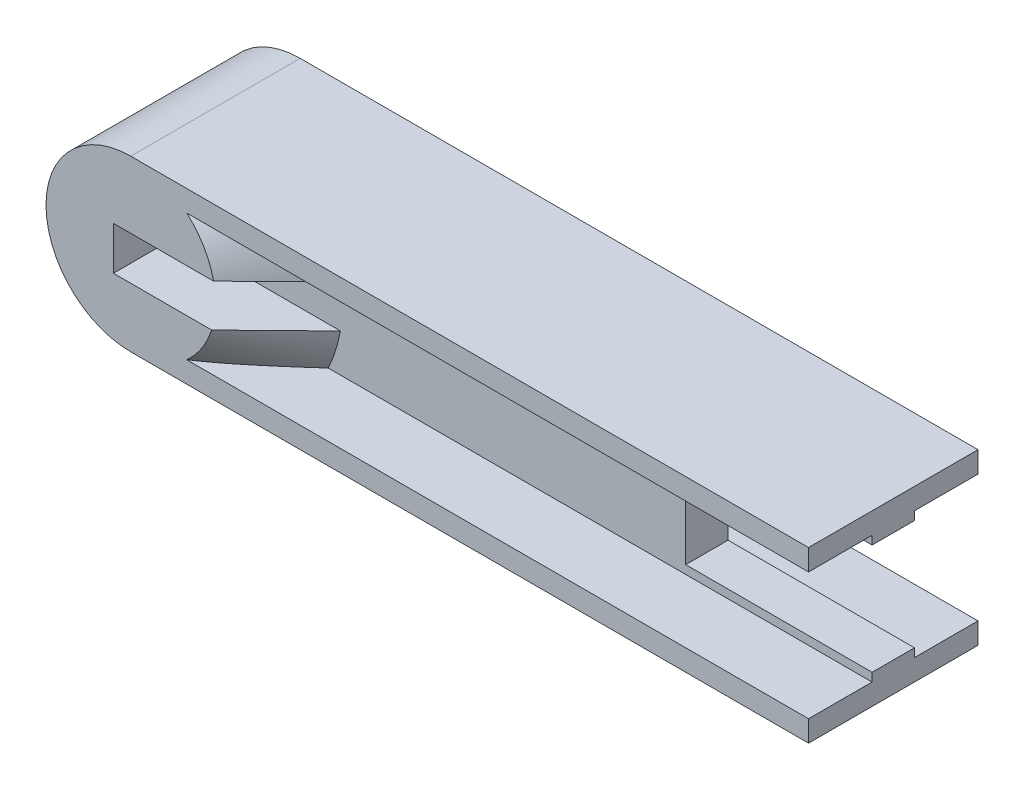
ISO-10303-21;
HEADER;
FILE_DESCRIPTION(('STEP AP214'),'2;1');
FILE_NAME('part.step','',(''),(''),'','','');
FILE_SCHEMA(('AUTOMOTIVE_DESIGN { 1 0 10303 214 1 1 1 1 }'));
ENDSEC;
DATA;
#1=APPLICATION_CONTEXT('core data for automotive mechanical design processes');
#2=APPLICATION_PROTOCOL_DEFINITION('international standard','automotive_design',2000,#1);
#3=PRODUCT_CONTEXT('',#1,'mechanical');
#4=PRODUCT('Part','Part','',(#3));
#5=PRODUCT_RELATED_PRODUCT_CATEGORY('part','',(#4));
#6=PRODUCT_DEFINITION_FORMATION('','',#4);
#7=PRODUCT_DEFINITION_CONTEXT('part definition',#1,'design');
#8=PRODUCT_DEFINITION('design','',#6,#7);
#9=PRODUCT_DEFINITION_SHAPE('','',#8);
#10=(LENGTH_UNIT() NAMED_UNIT(*) SI_UNIT(.MILLI.,.METRE.));
#11=(NAMED_UNIT(*) PLANE_ANGLE_UNIT() SI_UNIT($,.RADIAN.));
#12=(NAMED_UNIT(*) SI_UNIT($,.STERADIAN.) SOLID_ANGLE_UNIT());
#13=UNCERTAINTY_MEASURE_WITH_UNIT(LENGTH_MEASURE(1.E-05),#10,'distance_accuracy_value','');
#14=(GEOMETRIC_REPRESENTATION_CONTEXT(3) GLOBAL_UNCERTAINTY_ASSIGNED_CONTEXT((#13)) GLOBAL_UNIT_ASSIGNED_CONTEXT((#10,
#11,#12)) REPRESENTATION_CONTEXT('',''));
#15=CARTESIAN_POINT('',(0.,0.,0.));
#16=DIRECTION('',(0.,0.,1.));
#17=DIRECTION('',(1.,0.,0.));
#18=AXIS2_PLACEMENT_3D('',#15,#16,#17);
#19=CARTESIAN_POINT('',(40.,10.,10.));
#20=DIRECTION('',(-1.,0.,0.));
#21=DIRECTION('',(0.,0.,1.));
#22=AXIS2_PLACEMENT_3D('',#19,#20,#21);
#23=PLANE('',#22);
#24=DIRECTION('',(0.,1.,0.));
#25=VECTOR('',#24,1.);
#26=CARTESIAN_POINT('',(40.,-7.5,2.49999999999998));
#27=LINE('',#26,#25);
#28=CARTESIAN_POINT('',(40.,6.49999999999999,2.49999999999998));
#29=VERTEX_POINT('',#28);
#30=CARTESIAN_POINT('',(40.,7.5,2.49999999999998));
#31=VERTEX_POINT('',#30);
#32=EDGE_CURVE('E204',#29,#31,#27,.T.);
#33=ORIENTED_EDGE('',*,*,#32,.F.);
#34=DIRECTION('',(0.,0.,-1.));
#35=VECTOR('',#34,1.);
#36=CARTESIAN_POINT('',(40.,6.49999999999999,10.001));
#37=LINE('',#36,#35);
#38=CARTESIAN_POINT('',(40.,6.49999999999999,-2.5));
#39=VERTEX_POINT('',#38);
#40=EDGE_CURVE('E186',#29,#39,#37,.T.);
#41=ORIENTED_EDGE('',*,*,#40,.T.);
#42=DIRECTION('',(0.,1.,0.));
#43=VECTOR('',#42,1.);
#44=CARTESIAN_POINT('',(40.,-7.5,-2.5));
#45=LINE('',#44,#43);
#46=CARTESIAN_POINT('',(40.,7.5,-2.5));
#47=VERTEX_POINT('',#46);
#48=EDGE_CURVE('E347',#39,#47,#45,.T.);
#49=ORIENTED_EDGE('',*,*,#48,.T.);
#50=DIRECTION('',(0.,0.,-1.));
#51=VECTOR('',#50,1.);
#52=CARTESIAN_POINT('',(40.,7.5,-10.));
#53=LINE('',#52,#51);
#54=CARTESIAN_POINT('',(40.,7.5,-10.));
#55=VERTEX_POINT('',#54);
#56=EDGE_CURVE('E348',#47,#55,#53,.T.);
#57=ORIENTED_EDGE('',*,*,#56,.T.);
#58=DIRECTION('',(0.,-1.,0.));
#59=VECTOR('',#58,1.);
#60=CARTESIAN_POINT('',(40.,10.,-10.));
#61=LINE('',#60,#59);
#62=CARTESIAN_POINT('',(40.,10.,-10.));
#63=VERTEX_POINT('',#62);
#64=EDGE_CURVE('E237',#63,#55,#61,.T.);
#65=ORIENTED_EDGE('',*,*,#64,.F.);
#66=DIRECTION('',(0.,0.,-1.));
#67=VECTOR('',#66,1.);
#68=CARTESIAN_POINT('',(40.,10.,10.));
#69=LINE('',#68,#67);
#70=CARTESIAN_POINT('',(40.,10.,10.));
#71=VERTEX_POINT('',#70);
#72=EDGE_CURVE('E217',#71,#63,#69,.T.);
#73=ORIENTED_EDGE('',*,*,#72,.F.);
#74=DIRECTION('',(0.,-1.,0.));
#75=VECTOR('',#74,1.);
#76=CARTESIAN_POINT('',(40.,10.,10.));
#77=LINE('',#76,#75);
#78=CARTESIAN_POINT('',(40.,7.5,10.));
#79=VERTEX_POINT('',#78);
#80=EDGE_CURVE('E241',#71,#79,#77,.T.);
#81=ORIENTED_EDGE('',*,*,#80,.T.);
#82=DIRECTION('',(0.,0.,-1.));
#83=VECTOR('',#82,1.);
#84=CARTESIAN_POINT('',(40.,7.5,2.49999999999998));
#85=LINE('',#84,#83);
#86=EDGE_CURVE('E328',#79,#31,#85,.T.);
#87=ORIENTED_EDGE('',*,*,#86,.T.);
#88=EDGE_LOOP('',(#33,#41,#49,#57,#65,#73,#81,#87));
#89=FACE_BOUND('',#88,.T.);
#90=ADVANCED_FACE('F36',(#89),#23,.F.);
#91=CARTESIAN_POINT('',(-40.,0.,10.0000000000001));
#92=DIRECTION('',(0.,0.,-1.));
#93=DIRECTION('',(-1.,0.,0.));
#94=AXIS2_PLACEMENT_3D('',#91,#92,#93);
#95=CONICAL_SURFACE('',#94,10.,0.785398163397442);
#96=CARTESIAN_POINT('',(-40.,0.,2.50000000000002));
#97=DIRECTION('',(0.,0.,-1.));
#98=DIRECTION('',(-1.,0.,0.));
#99=AXIS2_PLACEMENT_3D('',#96,#97,#98);
#100=CIRCLE('',#99,17.5);
#101=CARTESIAN_POINT('',(-22.757110573551,-2.98877303040103,2.50000000000001));
#102=VERTEX_POINT('',#101);
#103=CARTESIAN_POINT('',(-24.1886116991581,-7.5,2.50000000000002));
#104=VERTEX_POINT('',#103);
#105=EDGE_CURVE('E285',#102,#104,#100,.T.);
#106=ORIENTED_EDGE('',*,*,#105,.F.);
#107=CARTESIAN_POINT('',(-14.7445242726451,-2.98877303040103,-5.43170891706394));
#108=CARTESIAN_POINT('',(-15.6182505198501,-2.98877303040103,-4.56408729212419));
#109=CARTESIAN_POINT('',(-16.492241290446,-2.98877303040103,-3.69673127284562));
#110=CARTESIAN_POINT('',(-18.2412856881804,-2.98877303040103,-1.96271064478842));
#111=CARTESIAN_POINT('',(-19.1163395052938,-2.98877303040103,-1.09604622765608));
#112=CARTESIAN_POINT('',(-20.8718875580076,-2.98877303040103,0.640230436556813));
#113=CARTESIAN_POINT('',(-21.7523876758202,-2.98877303040103,1.5098367376275));
#114=CARTESIAN_POINT('',(-23.515054490883,-2.98877303040103,3.24698476354142));
#115=CARTESIAN_POINT('',(-24.3972207933,-2.98877303040103,4.11452688860678));
#116=CARTESIAN_POINT('',(-25.7277017430086,-2.98877303040103,5.41838491746409));
#117=CARTESIAN_POINT('',(-26.1748895320108,-2.98877303040103,5.85585039426884));
#118=CARTESIAN_POINT('',(-27.0703086668402,-2.98877303040103,6.72972865022292));
#119=CARTESIAN_POINT('',(-27.5185400313316,-2.98877303040103,7.16614141025597));
#120=CARTESIAN_POINT('',(-28.4166945700879,-2.98877303040103,8.03781070800355));
#121=CARTESIAN_POINT('',(-28.866618656977,-2.98877303040103,8.47306630617011));
#122=CARTESIAN_POINT('',(-29.768406985442,-2.98877303040103,9.34150635503631));
#123=CARTESIAN_POINT('',(-30.2202711010452,-2.98877303040103,9.77469093646614));
#124=CARTESIAN_POINT('',(-31.1255191615767,-2.98877303040103,10.6367767315578));
#125=CARTESIAN_POINT('',(-31.5788946047338,-2.98877303040103,11.0656868465697));
#126=CARTESIAN_POINT('',(-32.2623431121828,-2.98877303040103,11.7055566842361));
#127=CARTESIAN_POINT('',(-32.4907533729852,-2.98877303040103,11.9182914606851));
#128=CARTESIAN_POINT('',(-32.9490026502527,-2.98877303040103,12.3422116740212));
#129=CARTESIAN_POINT('',(-33.1788416460464,-2.98877303040103,12.5533971332281));
#130=CARTESIAN_POINT('',(-33.6401166830084,-2.98877303040103,12.9734927498295));
#131=CARTESIAN_POINT('',(-33.8715506173452,-2.98877303040103,13.1824052160268));
#132=CARTESIAN_POINT('',(-34.33688593183,-2.98877303040103,13.5974576621289));
#133=CARTESIAN_POINT('',(-34.5707872568108,-2.98877303040103,13.8035977037875));
#134=CARTESIAN_POINT('',(-35.0418761340152,-2.98877303040103,14.211919878851));
#135=CARTESIAN_POINT('',(-35.2790623331825,-2.98877303040103,14.4141035636829));
#136=CARTESIAN_POINT('',(-35.6384179205598,-2.98877303040103,14.7130541622946));
#137=CARTESIAN_POINT('',(-35.7587923358589,-2.98877303040103,14.8119781316089));
#138=CARTESIAN_POINT('',(-36.0009922082745,-2.98877303040103,15.008031314904));
#139=CARTESIAN_POINT('',(-36.1228176154753,-2.98877303040103,15.1051605903325));
#140=CARTESIAN_POINT('',(-36.3073099764119,-2.98877303040103,15.2495000301054));
#141=CARTESIAN_POINT('',(-36.3693186791307,-2.98877303040103,15.2975522537624));
#142=CARTESIAN_POINT('',(-36.4938357766987,-2.98877303040103,15.3930105333198));
#143=CARTESIAN_POINT('',(-36.5563441907755,-2.98877303040103,15.4404165641649));
#144=CARTESIAN_POINT('',(-36.6819130400563,-2.98877303040103,15.5344949495441));
#145=CARTESIAN_POINT('',(-36.7449734833915,-2.98877303040103,15.5811672932427));
#146=CARTESIAN_POINT('',(-36.8717063506098,-2.98877303040103,15.6736721450626));
#147=CARTESIAN_POINT('',(-36.9353787728793,-2.98877303040103,15.7195046553972));
#148=CARTESIAN_POINT('',(-37.1285972913829,-2.98877303040103,15.8564052982744));
#149=CARTESIAN_POINT('',(-37.2591922406827,-2.98877303040103,15.9460068964985));
#150=CARTESIAN_POINT('',(-37.5238288190294,-2.98877303040103,16.1200201939822));
#151=CARTESIAN_POINT('',(-37.6578706656219,-2.98877303040103,16.2044315645227));
#152=CARTESIAN_POINT('',(-37.9329095280649,-2.98877303040103,16.3677645106028));
#153=CARTESIAN_POINT('',(-38.0739916358583,-2.98877303040103,16.446544672916));
#154=CARTESIAN_POINT('',(-38.3615715613253,-2.98877303040103,16.5938384833167));
#155=CARTESIAN_POINT('',(-38.5080717435589,-2.98877303040103,16.6623475813819));
#156=CARTESIAN_POINT('',(-38.8052742741623,-2.98877303040103,16.7840914402237));
#157=CARTESIAN_POINT('',(-38.9558969010027,-2.98877303040103,16.8375137527618));
#158=CARTESIAN_POINT('',(-39.1858435065229,-2.98877303040103,16.9031910256877));
#159=CARTESIAN_POINT('',(-39.2631172508603,-2.98877303040103,16.9226672923141));
#160=CARTESIAN_POINT('',(-39.4188227358405,-2.98877303040103,16.9561939977938));
#161=CARTESIAN_POINT('',(-39.4972541197915,-2.98877303040103,16.9702460731525));
#162=CARTESIAN_POINT('',(-39.6705088933478,-2.98877303040103,16.994570114377));
#163=CARTESIAN_POINT('',(-39.7655184693589,-2.98877303040103,17.0035525685882));
#164=CARTESIAN_POINT('',(-39.9559640845932,-2.98877303040103,17.012416275352));
#165=CARTESIAN_POINT('',(-40.0514001165385,-2.98877303040103,17.0122976826321));
#166=CARTESIAN_POINT('',(-40.2422908401708,-2.98877303040103,17.0029457605008));
#167=CARTESIAN_POINT('',(-40.3377432841214,-2.98877303040103,16.9936672995145));
#168=CARTESIAN_POINT('',(-40.5273879092856,-2.98877303040103,16.9665058079521));
#169=CARTESIAN_POINT('',(-40.6215801910689,-2.98877303040103,16.9486234682871));
#170=CARTESIAN_POINT('',(-40.8180170893483,-2.98877303040103,16.9029292197619));
#171=CARTESIAN_POINT('',(-40.920060265781,-2.98877303040103,16.8742674370877));
#172=CARTESIAN_POINT('',(-41.1209629067274,-2.98877303040103,16.8093386199395));
#173=CARTESIAN_POINT('',(-41.2198390817942,-2.98877303040103,16.7731236533291));
#174=CARTESIAN_POINT('',(-41.3173306394025,-2.98877303040103,16.7337905393622));
#175=B_SPLINE_CURVE_WITH_KNOTS('',3,(#107,#108,#109,#110,#111,#112,#113,#114,#115,#116,#117,
#118,#119,#120,#121,#122,#123,#124,#125,#126,#127,#128,#129,#130,#131,#132,#133,#134,#135,#136,
#137,#138,#139,#140,#141,#142,#143,#144,#145,#146,#147,#148,#149,#150,#151,#152,#153,#154,#155,
#156,#157,#158,#159,#160,#161,#162,#163,#164,#165,#166,#167,#168,#169,#170,#171,#172,#173,#174),
.UNSPECIFIED.,.F.,.F.,(4,2,2,2,2,2,2,2,2,2,2,2,2,2,2,2,2,2,2,2,2,2,2,2,2,2,2,2,2,2,2,2,2,4),(0.,
3.69398017540125,7.38876459717517,11.1013714404907,14.8131876726317,16.6899326936052,
18.566711541622,20.4447142345938,22.3225967730828,24.1949010937752,25.131296377106,
26.067678143848,27.0029979568064,27.9382969015853,28.873221419511,29.3406314269986,
29.8080254012898,30.043366071396,30.2787158407816,30.5140690826845,30.7494217042479,
31.2244565952992,31.6995215413825,32.1839724690067,32.6686373754713,33.1469813963222,
33.3858889457456,33.624724359138,33.9105970967216,34.1964649741634,34.4837484162256,
34.7710087926213,35.0886376648048,35.4041453397935),.UNSPECIFIED.);
#176=CARTESIAN_POINT('',(-30.4570845244889,-2.98877303040103,10.));
#177=VERTEX_POINT('',#176);
#178=EDGE_CURVE('E11',#102,#177,#175,.T.);
#179=ORIENTED_EDGE('',*,*,#178,.T.);
#180=CARTESIAN_POINT('',(-40.,0.,10.));
#181=DIRECTION('',(0.,0.,1.));
#182=DIRECTION('',(1.,0.,0.));
#183=AXIS2_PLACEMENT_3D('',#180,#181,#182);
#184=CIRCLE('',#183,10.);
#185=CARTESIAN_POINT('',(-33.3856217223385,-7.5,10.));
#186=VERTEX_POINT('',#185);
#187=EDGE_CURVE('E365',#186,#177,#184,.T.);
#188=ORIENTED_EDGE('',*,*,#187,.F.);
#189=CARTESIAN_POINT('',(-24.1886116991581,-7.5,2.50000000000002));
#190=CARTESIAN_POINT('',(-24.5558585087573,-7.5,2.83176164391592));
#191=CARTESIAN_POINT('',(-24.92411994844,-7.5,3.16241019080172));
#192=CARTESIAN_POINT('',(-25.6631954709516,-7.5,3.82083627059252));
#193=CARTESIAN_POINT('',(-26.0340095397421,-7.5,4.14861381926439));
#194=CARTESIAN_POINT('',(-26.7782955983122,-7.5,4.80028713955975));
#195=CARTESIAN_POINT('',(-27.151764098284,-7.5,5.1241868906016));
#196=CARTESIAN_POINT('',(-27.9024907874228,-7.5,5.76756343158426));
#197=CARTESIAN_POINT('',(-28.2797489283174,-7.5,6.08704027774087));
#198=CARTESIAN_POINT('',(-29.0393823834933,-7.5,6.7206482286359));
#199=CARTESIAN_POINT('',(-29.4217624781195,-7.5,7.03477361262254));
#200=CARTESIAN_POINT('',(-30.1924788992259,-7.5,7.65556114538951));
#201=CARTESIAN_POINT('',(-30.5808143977761,-7.5,7.96222431651734));
#202=CARTESIAN_POINT('',(-31.1693370656366,-7.5,8.41488189040015));
#203=CARTESIAN_POINT('',(-31.3666355885924,-7.5,8.56463316642127));
#204=CARTESIAN_POINT('',(-31.7634407954171,-7.5,8.86117088315843));
#205=CARTESIAN_POINT('',(-31.962947400111,-7.5,9.0079574296508));
#206=CARTESIAN_POINT('',(-32.3645764660876,-7.5,9.29811466160598));
#207=CARTESIAN_POINT('',(-32.5667000879372,-7.5,9.44148374545928));
#208=CARTESIAN_POINT('',(-32.973875864108,-7.5,9.72405096673029));
#209=CARTESIAN_POINT('',(-33.178928377817,-7.5,9.86324858568512));
#210=CARTESIAN_POINT('',(-33.3856217223385,-7.5,10.0000000000001));
#211=B_SPLINE_CURVE_WITH_KNOTS('',3,(#189,#190,#191,#192,#193,#194,#195,#196,#197,#198,#199,
#200,#201,#202,#203,#204,#205,#206,#207,#208,#209,#210),.UNSPECIFIED.,.F.,.F.,(4,2,2,2,2,2,2,2,
2,2,4),(0.,1.4847381435903,2.96946812820856,4.4525149065041,5.93554281771689,7.42006751142696,
8.90438766206993,9.64744643904511,10.390478657988,11.1338525155219,11.8773183854893),.UNSPECIFIED.);
#212=EDGE_CURVE('E424',#104,#186,#211,.T.);
#213=ORIENTED_EDGE('',*,*,#212,.F.);
#214=EDGE_LOOP('',(#106,#179,#188,#213));
#215=FACE_BOUND('',#214,.T.);
#216=ADVANCED_FACE('F316',(#215),#95,.T.);
#217=CARTESIAN_POINT('',(0.,-7.5,0.));
#218=DIRECTION('',(0.,-1.,0.));
#219=DIRECTION('',(0.,0.,-1.));
#220=AXIS2_PLACEMENT_3D('',#217,#218,#219);
#221=PLANE('',#220);
#222=DIRECTION('',(-1.,0.,0.));
#223=VECTOR('',#222,1.);
#224=CARTESIAN_POINT('',(40.,-7.5,2.49999999999998));
#225=LINE('',#224,#223);
#226=CARTESIAN_POINT('',(40.,-7.5,2.49999999999998));
#227=VERTEX_POINT('',#226);
#228=EDGE_CURVE('E201',#227,#104,#225,.T.);
#229=ORIENTED_EDGE('',*,*,#228,.T.);
#230=ORIENTED_EDGE('',*,*,#212,.T.);
#231=DIRECTION('',(1.,0.,0.));
#232=VECTOR('',#231,1.);
#233=CARTESIAN_POINT('',(40.,-7.5,10.));
#234=LINE('',#233,#232);
#235=CARTESIAN_POINT('',(40.,-7.5,10.));
#236=VERTEX_POINT('',#235);
#237=EDGE_CURVE('E209',#186,#236,#234,.T.);
#238=ORIENTED_EDGE('',*,*,#237,.T.);
#239=DIRECTION('',(0.,0.,-1.));
#240=VECTOR('',#239,1.);
#241=CARTESIAN_POINT('',(40.,-7.5,2.49999999999998));
#242=LINE('',#241,#240);
#243=EDGE_CURVE('E339',#236,#227,#242,.T.);
#244=ORIENTED_EDGE('',*,*,#243,.T.);
#245=EDGE_LOOP('',(#229,#230,#238,#244));
#246=FACE_BOUND('',#245,.T.);
#247=ADVANCED_FACE('F291',(#246),#221,.F.);
#248=CARTESIAN_POINT('',(0.,7.5,0.));
#249=DIRECTION('',(0.,-1.,0.));
#250=DIRECTION('',(0.,0.,-1.));
#251=AXIS2_PLACEMENT_3D('',#248,#249,#250);
#252=PLANE('',#251);
#253=DIRECTION('',(1.,0.,0.));
#254=VECTOR('',#253,1.);
#255=CARTESIAN_POINT('',(40.,7.5,10.));
#256=LINE('',#255,#254);
#257=CARTESIAN_POINT('',(-33.3856217223385,7.5,10.));
#258=VERTEX_POINT('',#257);
#259=EDGE_CURVE('E212',#258,#79,#256,.T.);
#260=ORIENTED_EDGE('',*,*,#259,.F.);
#261=CARTESIAN_POINT('',(-33.3856217223385,7.5,10.0000000000001));
#262=CARTESIAN_POINT('',(-33.178928377817,7.5,9.86324858568512));
#263=CARTESIAN_POINT('',(-32.973875864108,7.5,9.7240509667303));
#264=CARTESIAN_POINT('',(-32.5667000879372,7.5,9.44148374545928));
#265=CARTESIAN_POINT('',(-32.3645764660876,7.5,9.29811466160598));
#266=CARTESIAN_POINT('',(-31.962947400111,7.5,9.0079574296508));
#267=CARTESIAN_POINT('',(-31.7634407954171,7.5,8.86117088315843));
#268=CARTESIAN_POINT('',(-31.3666355885924,7.5,8.56463316642127));
#269=CARTESIAN_POINT('',(-31.1693370656366,7.5,8.41488189040014));
#270=CARTESIAN_POINT('',(-30.5808143977761,7.5,7.96222431651734));
#271=CARTESIAN_POINT('',(-30.1924788992259,7.5,7.65556114538951));
#272=CARTESIAN_POINT('',(-29.4217624781195,7.5,7.03477361262254));
#273=CARTESIAN_POINT('',(-29.0393823834933,7.5,6.7206482286359));
#274=CARTESIAN_POINT('',(-28.2797489283175,7.5,6.08704027774087));
#275=CARTESIAN_POINT('',(-27.9024907874228,7.5,5.76756343158427));
#276=CARTESIAN_POINT('',(-27.151764098284,7.5,5.1241868906016));
#277=CARTESIAN_POINT('',(-26.7782955983122,7.5,4.80028713955976));
#278=CARTESIAN_POINT('',(-26.0340095397421,7.5,4.14861381926439));
#279=CARTESIAN_POINT('',(-25.6631954709516,7.5,3.82083627059252));
#280=CARTESIAN_POINT('',(-24.92411994844,7.5,3.16241019080172));
#281=CARTESIAN_POINT('',(-24.5558585087573,7.5,2.83176164391592));
#282=CARTESIAN_POINT('',(-24.1886116991581,7.5,2.50000000000002));
#283=B_SPLINE_CURVE_WITH_KNOTS('',3,(#261,#262,#263,#264,#265,#266,#267,#268,#269,#270,#271,
#272,#273,#274,#275,#276,#277,#278,#279,#280,#281,#282),.UNSPECIFIED.,.F.,.F.,(4,2,2,2,2,2,2,2,
2,2,4),(0.,0.743465869967439,1.4868397275013,2.22987194644423,2.9729307234194,4.45725087406238,
5.94177556777245,7.42480347898523,8.90785025728077,10.392580241899,11.8773183854893),.UNSPECIFIED.);
#284=CARTESIAN_POINT('',(-24.1886116991581,7.5,2.50000000000002));
#285=VERTEX_POINT('',#284);
#286=EDGE_CURVE('E278',#258,#285,#283,.T.);
#287=ORIENTED_EDGE('',*,*,#286,.T.);
#288=DIRECTION('',(-1.,0.,0.));
#289=VECTOR('',#288,1.);
#290=CARTESIAN_POINT('',(40.,7.5,2.49999999999998));
#291=LINE('',#290,#289);
#292=EDGE_CURVE('E333',#31,#285,#291,.T.);
#293=ORIENTED_EDGE('',*,*,#292,.F.);
#294=ORIENTED_EDGE('',*,*,#86,.F.);
#295=EDGE_LOOP('',(#260,#287,#293,#294));
#296=FACE_BOUND('',#295,.T.);
#297=ADVANCED_FACE('F262',(#296),#252,.T.);
#298=CARTESIAN_POINT('',(0.,-7.5,0.));
#299=DIRECTION('',(0.,-1.,0.));
#300=DIRECTION('',(0.,0.,-1.));
#301=AXIS2_PLACEMENT_3D('',#298,#299,#300);
#302=PLANE('',#301);
#303=DIRECTION('',(-1.,0.,0.));
#304=VECTOR('',#303,1.);
#305=CARTESIAN_POINT('',(-40.,-7.5,-10.));
#306=LINE('',#305,#304);
#307=CARTESIAN_POINT('',(40.,-7.5,-10.));
#308=VERTEX_POINT('',#307);
#309=CARTESIAN_POINT('',(-33.3856217223385,-7.5,-10.));
#310=VERTEX_POINT('',#309);
#311=EDGE_CURVE('E351',#308,#310,#306,.T.);
#312=ORIENTED_EDGE('',*,*,#311,.T.);
#313=CARTESIAN_POINT('',(-33.3856217223385,-7.5,-10.0000000000001));
#314=CARTESIAN_POINT('',(-33.178928377817,-7.5,-9.86324858568512));
#315=CARTESIAN_POINT('',(-32.973875864108,-7.5,-9.7240509667303));
#316=CARTESIAN_POINT('',(-32.5667000879371,-7.5,-9.44148374545928));
#317=CARTESIAN_POINT('',(-32.3645764660875,-7.5,-9.29811466160598));
#318=CARTESIAN_POINT('',(-31.962947400111,-7.5,-9.00795742965081));
#319=CARTESIAN_POINT('',(-31.7634407954171,-7.5,-8.86117088315843));
#320=CARTESIAN_POINT('',(-31.3666355885924,-7.5,-8.56463316642128));
#321=CARTESIAN_POINT('',(-31.1693370656366,-7.5,-8.41488189040015));
#322=CARTESIAN_POINT('',(-30.5808143977761,-7.5,-7.96222431651734));
#323=CARTESIAN_POINT('',(-30.1924788992258,-7.5,-7.6555611453895));
#324=CARTESIAN_POINT('',(-29.4217624781195,-7.5,-7.03477361262254));
#325=CARTESIAN_POINT('',(-29.0393823834933,-7.5,-6.7206482286359));
#326=CARTESIAN_POINT('',(-28.2797489283174,-7.5,-6.08704027774086));
#327=CARTESIAN_POINT('',(-27.9024907874228,-7.5,-5.76756343158426));
#328=CARTESIAN_POINT('',(-27.151764098284,-7.5,-5.12418689060159));
#329=CARTESIAN_POINT('',(-26.7782955983121,-7.5,-4.80028713955975));
#330=CARTESIAN_POINT('',(-26.034009539742,-7.5,-4.14861381926438));
#331=CARTESIAN_POINT('',(-25.6631954709516,-7.5,-3.82083627059251));
#332=CARTESIAN_POINT('',(-24.92411994844,-7.5,-3.16241019080171));
#333=CARTESIAN_POINT('',(-24.5558585087573,-7.5,-2.8317616439159));
#334=CARTESIAN_POINT('',(-24.1886116991581,-7.5,-2.5));
#335=B_SPLINE_CURVE_WITH_KNOTS('',3,(#313,#314,#315,#316,#317,#318,#319,#320,#321,#322,#323,
#324,#325,#326,#327,#328,#329,#330,#331,#332,#333,#334),.UNSPECIFIED.,.F.,.F.,(4,2,2,2,2,2,2,2,
2,2,4),(0.,0.743465869967449,1.48683972750131,2.22987194644423,2.97293072341941,4.4572508740624,
5.94177556777247,7.42480347898526,8.90785025728081,10.3925802418991,11.8773183854894),.UNSPECIFIED.);
#336=CARTESIAN_POINT('',(-24.1886116991581,-7.5,-2.5));
#337=VERTEX_POINT('',#336);
#338=EDGE_CURVE('E244',#310,#337,#335,.T.);
#339=ORIENTED_EDGE('',*,*,#338,.T.);
#340=DIRECTION('',(1.,0.,0.));
#341=VECTOR('',#340,1.);
#342=CARTESIAN_POINT('',(-40.,-7.5,-2.5));
#343=LINE('',#342,#341);
#344=CARTESIAN_POINT('',(40.,-7.5,-2.5));
#345=VERTEX_POINT('',#344);
#346=EDGE_CURVE('E356',#337,#345,#343,.T.);
#347=ORIENTED_EDGE('',*,*,#346,.T.);
#348=DIRECTION('',(0.,0.,-1.));
#349=VECTOR('',#348,1.);
#350=CARTESIAN_POINT('',(40.,-7.5,-10.));
#351=LINE('',#350,#349);
#352=EDGE_CURVE('E354',#345,#308,#351,.T.);
#353=ORIENTED_EDGE('',*,*,#352,.T.);
#354=EDGE_LOOP('',(#312,#339,#347,#353));
#355=FACE_BOUND('',#354,.T.);
#356=ADVANCED_FACE('F256',(#355),#302,.F.);
#357=CARTESIAN_POINT('',(0.,7.5,0.));
#358=DIRECTION('',(0.,-1.,0.));
#359=DIRECTION('',(0.,0.,-1.));
#360=AXIS2_PLACEMENT_3D('',#357,#358,#359);
#361=PLANE('',#360);
#362=DIRECTION('',(1.,0.,0.));
#363=VECTOR('',#362,1.);
#364=CARTESIAN_POINT('',(-40.,7.5,-2.5));
#365=LINE('',#364,#363);
#366=CARTESIAN_POINT('',(-24.1886116991581,7.5,-2.5));
#367=VERTEX_POINT('',#366);
#368=EDGE_CURVE('E207',#367,#47,#365,.T.);
#369=ORIENTED_EDGE('',*,*,#368,.F.);
#370=CARTESIAN_POINT('',(-24.1886116991581,7.5,-2.5));
#371=CARTESIAN_POINT('',(-24.5558585087573,7.5,-2.8317616439159));
#372=CARTESIAN_POINT('',(-24.92411994844,7.5,-3.16241019080171));
#373=CARTESIAN_POINT('',(-25.6631954709516,7.5,-3.82083627059251));
#374=CARTESIAN_POINT('',(-26.034009539742,7.5,-4.14861381926438));
#375=CARTESIAN_POINT('',(-26.7782955983121,7.5,-4.80028713955975));
#376=CARTESIAN_POINT('',(-27.151764098284,7.5,-5.12418689060159));
#377=CARTESIAN_POINT('',(-27.9024907874228,7.5,-5.76756343158426));
#378=CARTESIAN_POINT('',(-28.2797489283174,7.5,-6.08704027774086));
#379=CARTESIAN_POINT('',(-29.0393823834933,7.5,-6.7206482286359));
#380=CARTESIAN_POINT('',(-29.4217624781195,7.5,-7.03477361262255));
#381=CARTESIAN_POINT('',(-30.1924788992259,7.5,-7.65556114538951));
#382=CARTESIAN_POINT('',(-30.5808143977761,7.5,-7.96222431651734));
#383=CARTESIAN_POINT('',(-31.1693370656366,7.5,-8.41488189040015));
#384=CARTESIAN_POINT('',(-31.3666355885923,7.5,-8.56463316642128));
#385=CARTESIAN_POINT('',(-31.7634407954171,7.5,-8.86117088315843));
#386=CARTESIAN_POINT('',(-31.962947400111,7.5,-9.00795742965081));
#387=CARTESIAN_POINT('',(-32.3645764660875,7.5,-9.29811466160599));
#388=CARTESIAN_POINT('',(-32.5667000879372,7.5,-9.44148374545929));
#389=CARTESIAN_POINT('',(-32.973875864108,7.5,-9.7240509667303));
#390=CARTESIAN_POINT('',(-33.178928377817,7.5,-9.86324858568513));
#391=CARTESIAN_POINT('',(-33.3856217223385,7.5,-10.0000000000001));
#392=B_SPLINE_CURVE_WITH_KNOTS('',3,(#370,#371,#372,#373,#374,#375,#376,#377,#378,#379,#380,
#381,#382,#383,#384,#385,#386,#387,#388,#389,#390,#391),.UNSPECIFIED.,.F.,.F.,(4,2,2,2,2,2,2,2,
2,2,4),(0.,1.48473814359031,2.96946812820858,4.45251490650412,5.93554281771691,7.42006751142699,
8.90438766206997,9.64744643904514,10.3904786579881,11.1338525155219,11.8773183854894),.UNSPECIFIED.);
#393=CARTESIAN_POINT('',(-33.3856217223385,7.5,-10.));
#394=VERTEX_POINT('',#393);
#395=EDGE_CURVE('E272',#367,#394,#392,.T.);
#396=ORIENTED_EDGE('',*,*,#395,.T.);
#397=DIRECTION('',(-1.,0.,0.));
#398=VECTOR('',#397,1.);
#399=CARTESIAN_POINT('',(-40.,7.5,-10.));
#400=LINE('',#399,#398);
#401=EDGE_CURVE('E203',#55,#394,#400,.T.);
#402=ORIENTED_EDGE('',*,*,#401,.F.);
#403=ORIENTED_EDGE('',*,*,#56,.F.);
#404=EDGE_LOOP('',(#369,#396,#402,#403));
#405=FACE_BOUND('',#404,.T.);
#406=ADVANCED_FACE('F261',(#405),#361,.T.);
#407=CARTESIAN_POINT('',(-40.,10.,10.));
#408=DIRECTION('',(0.,0.,-1.));
#409=DIRECTION('',(-1.,0.,0.));
#410=AXIS2_PLACEMENT_3D('',#407,#408,#409);
#411=PLANE('',#410);
#412=ORIENTED_EDGE('',*,*,#187,.T.);
#413=DIRECTION('',(1.,0.,0.));
#414=VECTOR('',#413,1.);
#415=CARTESIAN_POINT('',(-42.0429441458443,-2.98877303040103,10.));
#416=LINE('',#415,#414);
#417=CARTESIAN_POINT('',(-42.0429441458443,-2.98877303040103,10.));
#418=VERTEX_POINT('',#417);
#419=EDGE_CURVE('E383',#418,#177,#416,.T.);
#420=ORIENTED_EDGE('',*,*,#419,.F.);
#421=DIRECTION('',(0.,-1.,0.));
#422=VECTOR('',#421,1.);
#423=CARTESIAN_POINT('',(-42.0429441458443,2.11324715402939,10.));
#424=LINE('',#423,#422);
#425=CARTESIAN_POINT('',(-42.0429441458443,2.11324715402939,10.));
#426=VERTEX_POINT('',#425);
#427=EDGE_CURVE('E380',#426,#418,#424,.T.);
#428=ORIENTED_EDGE('',*,*,#427,.F.);
#429=DIRECTION('',(-1.,0.,0.));
#430=VECTOR('',#429,1.);
#431=CARTESIAN_POINT('',(-42.0429441458443,2.11324715402939,10.));
#432=LINE('',#431,#430);
#433=CARTESIAN_POINT('',(-30.2258408818974,2.11324715402939,10.));
#434=VERTEX_POINT('',#433);
#435=EDGE_CURVE('E379',#434,#426,#432,.T.);
#436=ORIENTED_EDGE('',*,*,#435,.F.);
#437=EDGE_CURVE('E367',#434,#258,#184,.T.);
#438=ORIENTED_EDGE('',*,*,#437,.T.);
#439=ORIENTED_EDGE('',*,*,#259,.T.);
#440=ORIENTED_EDGE('',*,*,#80,.F.);
#441=DIRECTION('',(1.,0.,0.));
#442=VECTOR('',#441,1.);
#443=CARTESIAN_POINT('',(-40.,10.,10.));
#444=LINE('',#443,#442);
#445=CARTESIAN_POINT('',(-40.,10.,10.));
#446=VERTEX_POINT('',#445);
#447=EDGE_CURVE('E214',#446,#71,#444,.T.);
#448=ORIENTED_EDGE('',*,*,#447,.F.);
#449=CARTESIAN_POINT('',(-40.,-10.,10.));
#450=VERTEX_POINT('',#449);
#451=EDGE_CURVE('E340',#446,#450,#184,.T.);
#452=ORIENTED_EDGE('',*,*,#451,.T.);
#453=DIRECTION('',(1.,0.,0.));
#454=VECTOR('',#453,1.);
#455=CARTESIAN_POINT('',(-40.,-10.,10.));
#456=LINE('',#455,#454);
#457=CARTESIAN_POINT('',(40.,-10.,10.));
#458=VERTEX_POINT('',#457);
#459=EDGE_CURVE('E227',#450,#458,#456,.T.);
#460=ORIENTED_EDGE('',*,*,#459,.T.);
#461=EDGE_CURVE('E240',#236,#458,#77,.T.);
#462=ORIENTED_EDGE('',*,*,#461,.F.);
#463=ORIENTED_EDGE('',*,*,#237,.F.);
#464=EDGE_LOOP('',(#412,#420,#428,#436,#438,#439,#440,#448,#452,#460,#462,#463));
#465=FACE_BOUND('',#464,.T.);
#466=ADVANCED_FACE('F268',(#465),#411,.F.);
#467=CARTESIAN_POINT('',(40.,-6.5,-2.5));
#468=VERTEX_POINT('',#467);
#469=EDGE_CURVE('E196',#345,#468,#45,.T.);
#470=ORIENTED_EDGE('',*,*,#469,.T.);
#471=DIRECTION('',(0.,0.,-1.));
#472=VECTOR('',#471,1.);
#473=CARTESIAN_POINT('',(40.,-6.5,10.001));
#474=LINE('',#473,#472);
#475=CARTESIAN_POINT('',(40.,-6.5,2.49999999999998));
#476=VERTEX_POINT('',#475);
#477=EDGE_CURVE('E57',#476,#468,#474,.T.);
#478=ORIENTED_EDGE('',*,*,#477,.F.);
#479=EDGE_CURVE('E193',#227,#476,#27,.T.);
#480=ORIENTED_EDGE('',*,*,#479,.F.);
#481=ORIENTED_EDGE('',*,*,#243,.F.);
#482=ORIENTED_EDGE('',*,*,#461,.T.);
#483=DIRECTION('',(0.,0.,-1.));
#484=VECTOR('',#483,1.);
#485=CARTESIAN_POINT('',(40.,-10.,10.));
#486=LINE('',#485,#484);
#487=CARTESIAN_POINT('',(40.,-10.,-10.));
#488=VERTEX_POINT('',#487);
#489=EDGE_CURVE('E230',#458,#488,#486,.T.);
#490=ORIENTED_EDGE('',*,*,#489,.T.);
#491=EDGE_CURVE('E226',#308,#488,#61,.T.);
#492=ORIENTED_EDGE('',*,*,#491,.F.);
#493=ORIENTED_EDGE('',*,*,#352,.F.);
#494=EDGE_LOOP('',(#470,#478,#480,#481,#482,#490,#492,#493));
#495=FACE_BOUND('',#494,.T.);
#496=ADVANCED_FACE('F191',(#495),#23,.F.);
#497=CARTESIAN_POINT('',(-40.,10.,-10.));
#498=DIRECTION('',(0.,0.,1.));
#499=DIRECTION('',(1.,0.,0.));
#500=AXIS2_PLACEMENT_3D('',#497,#498,#499);
#501=PLANE('',#500);
#502=CARTESIAN_POINT('',(-40.,0.,-10.));
#503=DIRECTION('',(0.,0.,-1.));
#504=DIRECTION('',(-1.,0.,0.));
#505=AXIS2_PLACEMENT_3D('',#502,#503,#504);
#506=CIRCLE('',#505,3.8);
#507=CARTESIAN_POINT('',(-43.8,0.,-10.));
#508=VERTEX_POINT('',#507);
#509=EDGE_CURVE('E185',#508,#508,#506,.T.);
#510=ORIENTED_EDGE('',*,*,#509,.F.);
#511=EDGE_LOOP('',(#510));
#512=FACE_BOUND('',#511,.T.);
#513=DIRECTION('',(-1.,0.,0.));
#514=VECTOR('',#513,1.);
#515=CARTESIAN_POINT('',(-40.,-10.,-10.));
#516=LINE('',#515,#514);
#517=CARTESIAN_POINT('',(-40.,-10.,-10.));
#518=VERTEX_POINT('',#517);
#519=EDGE_CURVE('E233',#488,#518,#516,.T.);
#520=ORIENTED_EDGE('',*,*,#519,.T.);
#521=CARTESIAN_POINT('',(-40.,0.,-10.));
#522=DIRECTION('',(0.,0.,1.));
#523=DIRECTION('',(1.,0.,0.));
#524=AXIS2_PLACEMENT_3D('',#521,#522,#523);
#525=CIRCLE('',#524,10.);
#526=CARTESIAN_POINT('',(-40.,10.,-10.));
#527=VERTEX_POINT('',#526);
#528=EDGE_CURVE('E363',#527,#518,#525,.T.);
#529=ORIENTED_EDGE('',*,*,#528,.F.);
#530=DIRECTION('',(-1.,0.,0.));
#531=VECTOR('',#530,1.);
#532=CARTESIAN_POINT('',(-40.,10.,-10.));
#533=LINE('',#532,#531);
#534=EDGE_CURVE('E220',#63,#527,#533,.T.);
#535=ORIENTED_EDGE('',*,*,#534,.F.);
#536=ORIENTED_EDGE('',*,*,#64,.T.);
#537=ORIENTED_EDGE('',*,*,#401,.T.);
#538=EDGE_CURVE('E360',#310,#394,#525,.T.);
#539=ORIENTED_EDGE('',*,*,#538,.F.);
#540=ORIENTED_EDGE('',*,*,#311,.F.);
#541=ORIENTED_EDGE('',*,*,#491,.T.);
#542=EDGE_LOOP('',(#520,#529,#535,#536,#537,#539,#540,#541));
#543=FACE_BOUND('',#542,.T.);
#544=ADVANCED_FACE('F300',(#512,#543),#501,.F.);
#545=CARTESIAN_POINT('',(0.,10.,0.));
#546=DIRECTION('',(0.,1.,0.));
#547=DIRECTION('',(0.,0.,1.));
#548=AXIS2_PLACEMENT_3D('',#545,#546,#547);
#549=PLANE('',#548);
#550=ORIENTED_EDGE('',*,*,#447,.T.);
#551=ORIENTED_EDGE('',*,*,#72,.T.);
#552=ORIENTED_EDGE('',*,*,#534,.T.);
#553=DIRECTION('',(0.,0.,1.));
#554=VECTOR('',#553,1.);
#555=CARTESIAN_POINT('',(-40.,10.,10.));
#556=LINE('',#555,#554);
#557=EDGE_CURVE('E223',#527,#446,#556,.T.);
#558=ORIENTED_EDGE('',*,*,#557,.T.);
#559=EDGE_LOOP('',(#550,#551,#552,#558));
#560=FACE_BOUND('',#559,.T.);
#561=ADVANCED_FACE('F297',(#560),#549,.T.);
#562=CARTESIAN_POINT('',(0.,-10.,0.));
#563=DIRECTION('',(0.,1.,0.));
#564=DIRECTION('',(0.,0.,1.));
#565=AXIS2_PLACEMENT_3D('',#562,#563,#564);
#566=PLANE('',#565);
#567=ORIENTED_EDGE('',*,*,#459,.F.);
#568=DIRECTION('',(0.,0.,1.));
#569=VECTOR('',#568,1.);
#570=CARTESIAN_POINT('',(-40.,-10.,10.));
#571=LINE('',#570,#569);
#572=EDGE_CURVE('E218',#518,#450,#571,.T.);
#573=ORIENTED_EDGE('',*,*,#572,.F.);
#574=ORIENTED_EDGE('',*,*,#519,.F.);
#575=ORIENTED_EDGE('',*,*,#489,.F.);
#576=EDGE_LOOP('',(#567,#573,#574,#575));
#577=FACE_BOUND('',#576,.T.);
#578=ADVANCED_FACE('F296',(#577),#566,.F.);
#579=CARTESIAN_POINT('',(40.,-7.5,2.49999999999998));
#580=DIRECTION('',(0.,0.,-1.));
#581=DIRECTION('',(-1.,0.,0.));
#582=AXIS2_PLACEMENT_3D('',#579,#580,#581);
#583=PLANE('',#582);
#584=DIRECTION('',(0.,-1.,0.));
#585=VECTOR('',#584,1.);
#586=CARTESIAN_POINT('',(18.,6.5,2.49999999999999));
#587=LINE('',#586,#585);
#588=CARTESIAN_POINT('',(18.,6.5,2.49999999999999));
#589=VERTEX_POINT('',#588);
#590=CARTESIAN_POINT('',(18.,-6.5,2.49999999999998));
#591=VERTEX_POINT('',#590);
#592=EDGE_CURVE('E402',#589,#591,#587,.T.);
#593=ORIENTED_EDGE('',*,*,#592,.F.);
#594=DIRECTION('',(-1.,0.,0.));
#595=VECTOR('',#594,1.);
#596=CARTESIAN_POINT('',(40.,6.49999999999999,2.49999999999998));
#597=LINE('',#596,#595);
#598=EDGE_CURVE('E336',#29,#589,#597,.T.);
#599=ORIENTED_EDGE('',*,*,#598,.F.);
#600=ORIENTED_EDGE('',*,*,#32,.T.);
#601=ORIENTED_EDGE('',*,*,#292,.T.);
#602=CARTESIAN_POINT('',(-22.6280632494248,2.11324715402939,2.50000000000001));
#603=VERTEX_POINT('',#602);
#604=EDGE_CURVE('E286',#285,#603,#100,.T.);
#605=ORIENTED_EDGE('',*,*,#604,.T.);
#606=DIRECTION('',(-1.,0.,0.));
#607=VECTOR('',#606,1.);
#608=CARTESIAN_POINT('',(-42.0429441458443,2.11324715402939,2.50000000000002));
#609=LINE('',#608,#607);
#610=CARTESIAN_POINT('',(-42.0429441458443,2.11324715402939,2.50000000000002));
#611=VERTEX_POINT('',#610);
#612=EDGE_CURVE('E65',#603,#611,#609,.T.);
#613=ORIENTED_EDGE('',*,*,#612,.T.);
#614=DIRECTION('',(0.,-1.,0.));
#615=VECTOR('',#614,1.);
#616=CARTESIAN_POINT('',(-42.0429441458443,2.11324715402939,2.50000000000002));
#617=LINE('',#616,#615);
#618=CARTESIAN_POINT('',(-42.0429441458443,-2.98877303040103,2.50000000000002));
#619=VERTEX_POINT('',#618);
#620=EDGE_CURVE('E369',#611,#619,#617,.T.);
#621=ORIENTED_EDGE('',*,*,#620,.T.);
#622=DIRECTION('',(1.,0.,0.));
#623=VECTOR('',#622,1.);
#624=CARTESIAN_POINT('',(-42.0429441458443,-2.98877303040103,2.50000000000002));
#625=LINE('',#624,#623);
#626=EDGE_CURVE('E374',#619,#102,#625,.T.);
#627=ORIENTED_EDGE('',*,*,#626,.T.);
#628=ORIENTED_EDGE('',*,*,#105,.T.);
#629=ORIENTED_EDGE('',*,*,#228,.F.);
#630=ORIENTED_EDGE('',*,*,#479,.T.);
#631=DIRECTION('',(1.,0.,0.));
#632=VECTOR('',#631,1.);
#633=CARTESIAN_POINT('',(40.,-6.5,2.49999999999998));
#634=LINE('',#633,#632);
#635=EDGE_CURVE('E178',#591,#476,#634,.T.);
#636=ORIENTED_EDGE('',*,*,#635,.F.);
#637=EDGE_LOOP('',(#593,#599,#600,#601,#605,#613,#621,#627,#628,#629,#630,#636));
#638=FACE_BOUND('',#637,.T.);
#639=ADVANCED_FACE('F199',(#638),#583,.F.);
#640=CARTESIAN_POINT('',(-40.,-7.5,-2.5));
#641=DIRECTION('',(0.,0.,1.));
#642=DIRECTION('',(1.,0.,0.));
#643=AXIS2_PLACEMENT_3D('',#640,#641,#642);
#644=PLANE('',#643);
#645=ORIENTED_EDGE('',*,*,#48,.F.);
#646=DIRECTION('',(1.,0.,0.));
#647=VECTOR('',#646,1.);
#648=CARTESIAN_POINT('',(40.,6.49999999999999,-2.5));
#649=LINE('',#648,#647);
#650=CARTESIAN_POINT('',(18.,6.5,-2.5));
#651=VERTEX_POINT('',#650);
#652=EDGE_CURVE('E197',#651,#39,#649,.T.);
#653=ORIENTED_EDGE('',*,*,#652,.F.);
#654=DIRECTION('',(0.,1.,0.));
#655=VECTOR('',#654,1.);
#656=CARTESIAN_POINT('',(18.,6.5,-2.5));
#657=LINE('',#656,#655);
#658=CARTESIAN_POINT('',(18.,-6.5,-2.5));
#659=VERTEX_POINT('',#658);
#660=EDGE_CURVE('E396',#659,#651,#657,.T.);
#661=ORIENTED_EDGE('',*,*,#660,.F.);
#662=DIRECTION('',(-1.,0.,0.));
#663=VECTOR('',#662,1.);
#664=CARTESIAN_POINT('',(40.,-6.5,-2.5));
#665=LINE('',#664,#663);
#666=EDGE_CURVE('E399',#468,#659,#665,.T.);
#667=ORIENTED_EDGE('',*,*,#666,.F.);
#668=ORIENTED_EDGE('',*,*,#469,.F.);
#669=ORIENTED_EDGE('',*,*,#346,.F.);
#670=CARTESIAN_POINT('',(-40.,0.,-2.5));
#671=DIRECTION('',(0.,0.,1.));
#672=DIRECTION('',(1.,0.,0.));
#673=AXIS2_PLACEMENT_3D('',#670,#671,#672);
#674=CIRCLE('',#673,17.5);
#675=EDGE_CURVE('E251',#337,#367,#674,.T.);
#676=ORIENTED_EDGE('',*,*,#675,.T.);
#677=ORIENTED_EDGE('',*,*,#368,.T.);
#678=EDGE_LOOP('',(#645,#653,#661,#667,#668,#669,#676,#677));
#679=FACE_BOUND('',#678,.T.);
#680=ADVANCED_FACE('F270',(#679),#644,.F.);
#681=CARTESIAN_POINT('',(-40.,0.,10.));
#682=DIRECTION('',(0.,0.,-1.));
#683=DIRECTION('',(-1.,0.,0.));
#684=AXIS2_PLACEMENT_3D('',#681,#682,#683);
#685=CYLINDRICAL_SURFACE('',#684,10.);
#686=ORIENTED_EDGE('',*,*,#557,.F.);
#687=ORIENTED_EDGE('',*,*,#528,.T.);
#688=ORIENTED_EDGE('',*,*,#572,.T.);
#689=ORIENTED_EDGE('',*,*,#451,.F.);
#690=EDGE_LOOP('',(#686,#687,#688,#689));
#691=FACE_BOUND('',#690,.T.);
#692=ADVANCED_FACE('F264',(#691),#685,.T.);
#693=CARTESIAN_POINT('',(-40.,0.,-10.0000000000001));
#694=DIRECTION('',(0.,0.,1.));
#695=DIRECTION('',(1.,0.,0.));
#696=AXIS2_PLACEMENT_3D('',#693,#694,#695);
#697=CONICAL_SURFACE('',#696,10.,0.785398163397443);
#698=ORIENTED_EDGE('',*,*,#395,.F.);
#699=ORIENTED_EDGE('',*,*,#675,.F.);
#700=ORIENTED_EDGE('',*,*,#338,.F.);
#701=ORIENTED_EDGE('',*,*,#538,.T.);
#702=EDGE_LOOP('',(#698,#699,#700,#701));
#703=FACE_BOUND('',#702,.T.);
#704=ADVANCED_FACE('F253',(#703),#697,.T.);
#705=ORIENTED_EDGE('',*,*,#437,.F.);
#706=CARTESIAN_POINT('',(-41.3173306394025,2.11324715402939,17.5097844375394));
#707=CARTESIAN_POINT('',(-41.2438017618782,2.11324715402939,17.5486465497847));
#708=CARTESIAN_POINT('',(-41.1692641844892,2.11324715402939,17.5857655712463));
#709=CARTESIAN_POINT('',(-41.0177074914745,2.11324715402939,17.6554426942477));
#710=CARTESIAN_POINT('',(-40.9406790026537,2.11324715402939,17.6879802828573));
#711=CARTESIAN_POINT('',(-40.7836507388614,2.11324715402939,17.7473108460171));
#712=CARTESIAN_POINT('',(-40.703631327307,2.11324715402939,17.7740528449647));
#713=CARTESIAN_POINT('',(-40.5415410579837,2.11324715402939,17.819848163269));
#714=CARTESIAN_POINT('',(-40.4594746258689,2.11324715402939,17.8389167615971));
#715=CARTESIAN_POINT('',(-40.3139626981693,2.11324715402939,17.8644489827711));
#716=CARTESIAN_POINT('',(-40.2508575370045,2.11324715402939,17.8728526334203));
#717=CARTESIAN_POINT('',(-40.1241369719853,2.11324715402939,17.8840500287689));
#718=CARTESIAN_POINT('',(-40.0605215434949,2.11324715402939,17.8868435009476));
#719=CARTESIAN_POINT('',(-39.9337531302171,2.11324715402939,17.8866583369111));
#720=CARTESIAN_POINT('',(-39.870600080698,2.11324715402939,17.8837206942252));
#721=CARTESIAN_POINT('',(-39.7447979506762,2.11324715402939,17.8723220947161));
#722=CARTESIAN_POINT('',(-39.6821489301402,2.11324715402939,17.8638604902389));
#723=CARTESIAN_POINT('',(-39.53887368355,2.11324715402939,17.8384986747303));
#724=CARTESIAN_POINT('',(-39.4585629171856,2.11324715402939,17.8198166324159));
#725=CARTESIAN_POINT('',(-39.2999925027402,2.11324715402939,17.7751364034681));
#726=CARTESIAN_POINT('',(-39.2217343952947,2.11324715402939,17.7491328842522));
#727=CARTESIAN_POINT('',(-39.0668242765288,2.11324715402939,17.6910112916733));
#728=CARTESIAN_POINT('',(-38.9901906143932,2.11324715402939,17.6588449907398));
#729=CARTESIAN_POINT('',(-38.8391164790582,2.11324715402939,17.5898223737394));
#730=CARTESIAN_POINT('',(-38.7646754916715,2.11324715402939,17.55296716819));
#731=CARTESIAN_POINT('',(-38.561908095694,2.11324715402939,17.4462220143337));
#732=CARTESIAN_POINT('',(-38.4356060126535,2.11324715402939,17.3725055233383));
#733=CARTESIAN_POINT('',(-38.1875871447354,2.11324715402939,17.2176812966841));
#734=CARTESIAN_POINT('',(-38.0658741908248,2.11324715402939,17.136567570865));
#735=CARTESIAN_POINT('',(-37.8256321821816,2.11324715402939,16.9691153330204));
#736=CARTESIAN_POINT('',(-37.7071126309883,2.11324715402939,16.8827632808173));
#737=CARTESIAN_POINT('',(-37.4727805335687,2.11324715402939,16.7065671728968));
#738=CARTESIAN_POINT('',(-37.3569670995541,2.11324715402939,16.6167242889143));
#739=CARTESIAN_POINT('',(-37.1268937899916,2.11324715402939,16.4340998755029));
#740=CARTESIAN_POINT('',(-37.0126424971518,2.11324715402939,16.3413075757926));
#741=CARTESIAN_POINT('',(-36.7857252555038,2.11324715402939,16.1537942458883));
#742=CARTESIAN_POINT('',(-36.6730594199364,2.11324715402939,16.0590730790963));
#743=CARTESIAN_POINT('',(-36.4491781785723,2.11324715402939,15.8683269821111));
#744=CARTESIAN_POINT('',(-36.3379605869826,2.11324715402939,15.7723046121117));
#745=CARTESIAN_POINT('',(-36.1165318502622,2.11324715402939,15.5791152435203));
#746=CARTESIAN_POINT('',(-36.006320674074,2.11324715402939,15.4819482804632));
#747=CARTESIAN_POINT('',(-35.6800762883695,2.11324715402939,15.1919161536353));
#748=CARTESIAN_POINT('',(-35.4652053321505,2.11324715402939,14.9977443271019));
#749=CARTESIAN_POINT('',(-35.0375963707381,2.11324715402939,14.6070630517848));
#750=CARTESIAN_POINT('',(-34.8248584301393,2.11324715402939,14.4105535325999));
#751=CARTESIAN_POINT('',(-34.4008957403591,2.11324715402939,14.0158719404658));
#752=CARTESIAN_POINT('',(-34.1896711310663,2.11324715402939,13.8176997174045));
#753=CARTESIAN_POINT('',(-33.7683550356614,2.11324715402939,13.4201536004226));
#754=CARTESIAN_POINT('',(-33.558263556178,2.11324715402939,13.2207796994865));
#755=CARTESIAN_POINT('',(-32.9289018504121,2.11324715402939,12.620980710473));
#756=CARTESIAN_POINT('',(-32.5109069924384,2.11324715402939,12.2192181085934));
#757=CARTESIAN_POINT('',(-31.6770073899516,2.11324715402939,11.4135797575912));
#758=CARTESIAN_POINT('',(-31.2611025346364,2.11324715402939,11.009704122859));
#759=CARTESIAN_POINT('',(-30.432831681958,2.11324715402939,10.2026590280855));
#760=CARTESIAN_POINT('',(-30.0204585456511,2.11324715402939,9.79949689181298));
#761=CARTESIAN_POINT('',(-29.1966490770196,2.11324715402939,8.99220591806045));
#762=CARTESIAN_POINT('',(-28.7852127577576,2.11324715402939,8.58807706726006));
#763=CARTESIAN_POINT('',(-27.5521709961242,2.11324715402939,7.37493056273703));
#764=CARTESIAN_POINT('',(-26.7315680561389,2.11324715402939,6.56489425084941));
#765=CARTESIAN_POINT('',(-24.9739455903213,2.11324715402939,4.82669823608481));
#766=CARTESIAN_POINT('',(-24.0371569236964,2.11324715402939,3.89830534231573));
#767=CARTESIAN_POINT('',(-22.1646349973476,2.11324715402939,2.04024836633504));
#768=CARTESIAN_POINT('',(-21.2289018663265,2.11324715402939,1.11058415445142));
#769=CARTESIAN_POINT('',(-19.3533408291327,2.11324715402939,-0.754282826089247));
#770=CARTESIAN_POINT('',(-18.4135167199709,2.11324715402939,-1.68948941237644));
#771=CARTESIAN_POINT('',(-16.5344935442614,2.11324715402939,-3.56031758332405));
#772=CARTESIAN_POINT('',(-15.5952944189793,2.11324715402939,-4.49593910898799));
#773=CARTESIAN_POINT('',(-14.6562432755471,2.11324715402939,-5.43170891706394));
#774=B_SPLINE_CURVE_WITH_KNOTS('',3,(#706,#707,#708,#709,#710,#711,#712,#713,#714,#715,#716,
#717,#718,#719,#720,#721,#722,#723,#724,#725,#726,#727,#728,#729,#730,#731,#732,#733,#734,#735,
#736,#737,#738,#739,#740,#741,#742,#743,#744,#745,#746,#747,#748,#749,#750,#751,#752,#753,#754,
#755,#756,#757,#758,#759,#760,#761,#762,#763,#764,#765,#766,#767,#768,#769,#770,#771,#772,#773),
.UNSPECIFIED.,.F.,.F.,(4,2,2,2,2,2,2,2,2,2,2,2,2,2,2,2,2,2,2,2,2,2,2,2,2,2,2,2,2,2,2,2,2,4),(0.,
0.249594215772597,0.500272660937686,0.753073733202583,1.00536891722642,1.19612838962054,
1.38689712814925,1.57630633758869,1.76573775819482,2.01266916569443,2.25978089250523,
2.50891184220027,2.75798389732851,3.19626717734198,3.63490857808758,4.07473656265438,
4.51441816848811,4.95594901444897,5.39751123815133,5.83830382794492,6.27908276878661,
7.14787367040813,8.01669080282661,8.88558723636962,9.75448874747908,11.4937825328046,
13.2329831148693,14.9631025751963,16.693246013739,20.1524225262206,24.1091088940906,
28.0662344869522,32.0437870940328,36.0208892218892),.UNSPECIFIED.);
#775=EDGE_CURVE('E50',#434,#603,#774,.T.);
#776=ORIENTED_EDGE('',*,*,#775,.T.);
#777=ORIENTED_EDGE('',*,*,#604,.F.);
#778=ORIENTED_EDGE('',*,*,#286,.F.);
#779=EDGE_LOOP('',(#705,#776,#777,#778));
#780=FACE_BOUND('',#779,.T.);
#781=ADVANCED_FACE('F38',(#780),#95,.T.);
#782=CARTESIAN_POINT('',(-42.0429441458443,-2.98877303040103,-22.4286533240132));
#783=DIRECTION('',(0.,-1.,0.));
#784=DIRECTION('',(0.,0.,-1.));
#785=AXIS2_PLACEMENT_3D('',#782,#783,#784);
#786=PLANE('',#785);
#787=ORIENTED_EDGE('',*,*,#626,.F.);
#788=DIRECTION('',(0.,0.,1.));
#789=VECTOR('',#788,1.);
#790=CARTESIAN_POINT('',(-42.0429441458443,-2.98877303040103,-22.4286533240132));
#791=LINE('',#790,#789);
#792=EDGE_CURVE('E364',#619,#418,#791,.T.);
#793=ORIENTED_EDGE('',*,*,#792,.T.);
#794=ORIENTED_EDGE('',*,*,#419,.T.);
#795=ORIENTED_EDGE('',*,*,#178,.F.);
#796=EDGE_LOOP('',(#787,#793,#794,#795));
#797=FACE_BOUND('',#796,.T.);
#798=ADVANCED_FACE('F448',(#797),#786,.F.);
#799=CARTESIAN_POINT('',(-42.0429441458443,2.11324715402939,-22.4286533240132));
#800=DIRECTION('',(0.,1.,0.));
#801=DIRECTION('',(0.,0.,1.));
#802=AXIS2_PLACEMENT_3D('',#799,#800,#801);
#803=PLANE('',#802);
#804=ORIENTED_EDGE('',*,*,#435,.T.);
#805=DIRECTION('',(0.,0.,1.));
#806=VECTOR('',#805,1.);
#807=CARTESIAN_POINT('',(-42.0429441458443,2.11324715402939,-22.4286533240132));
#808=LINE('',#807,#806);
#809=EDGE_CURVE('E370',#611,#426,#808,.T.);
#810=ORIENTED_EDGE('',*,*,#809,.F.);
#811=ORIENTED_EDGE('',*,*,#612,.F.);
#812=ORIENTED_EDGE('',*,*,#775,.F.);
#813=EDGE_LOOP('',(#804,#810,#811,#812));
#814=FACE_BOUND('',#813,.T.);
#815=ADVANCED_FACE('F495',(#814),#803,.F.);
#816=CARTESIAN_POINT('',(-42.0429441458443,2.11324715402939,-22.4286533240132));
#817=DIRECTION('',(-1.,0.,0.));
#818=DIRECTION('',(0.,0.,1.));
#819=AXIS2_PLACEMENT_3D('',#816,#817,#818);
#820=PLANE('',#819);
#821=ORIENTED_EDGE('',*,*,#809,.T.);
#822=ORIENTED_EDGE('',*,*,#427,.T.);
#823=ORIENTED_EDGE('',*,*,#792,.F.);
#824=ORIENTED_EDGE('',*,*,#620,.F.);
#825=EDGE_LOOP('',(#821,#822,#823,#824));
#826=FACE_BOUND('',#825,.T.);
#827=ADVANCED_FACE('F491',(#826),#820,.F.);
#828=CARTESIAN_POINT('',(-40.,0.,-5.));
#829=DIRECTION('',(0.,0.,-1.));
#830=DIRECTION('',(-1.,0.,0.));
#831=AXIS2_PLACEMENT_3D('',#828,#829,#830);
#832=CYLINDRICAL_SURFACE('',#831,3.8);
#833=CARTESIAN_POINT('',(-40.,0.,-5.));
#834=DIRECTION('',(0.,0.,-1.));
#835=DIRECTION('',(-1.,0.,0.));
#836=AXIS2_PLACEMENT_3D('',#833,#834,#835);
#837=CIRCLE('',#836,3.8);
#838=CARTESIAN_POINT('',(-43.8,0.,-5.));
#839=VERTEX_POINT('',#838);
#840=EDGE_CURVE('E384',#839,#839,#837,.T.);
#841=ORIENTED_EDGE('',*,*,#840,.F.);
#842=EDGE_LOOP('',(#841));
#843=FACE_BOUND('',#842,.T.);
#844=ORIENTED_EDGE('',*,*,#509,.T.);
#845=EDGE_LOOP('',(#844));
#846=FACE_BOUND('',#845,.T.);
#847=ADVANCED_FACE('F487',(#843,#846),#832,.F.);
#848=CARTESIAN_POINT('',(-40.,0.,-5.));
#849=DIRECTION('',(0.,0.,-1.));
#850=DIRECTION('',(-1.,0.,0.));
#851=AXIS2_PLACEMENT_3D('',#848,#849,#850);
#852=PLANE('',#851);
#853=ORIENTED_EDGE('',*,*,#840,.T.);
#854=EDGE_LOOP('',(#853));
#855=FACE_BOUND('',#854,.T.);
#856=ADVANCED_FACE('F463',(#855),#852,.T.);
#857=CARTESIAN_POINT('',(40.,6.49999999999999,10.001));
#858=DIRECTION('',(0.,1.,0.));
#859=DIRECTION('',(-1.,0.,0.));
#860=AXIS2_PLACEMENT_3D('',#857,#858,#859);
#861=PLANE('',#860);
#862=ORIENTED_EDGE('',*,*,#598,.T.);
#863=DIRECTION('',(0.,0.,-1.));
#864=VECTOR('',#863,1.);
#865=CARTESIAN_POINT('',(18.,6.5,10.001));
#866=LINE('',#865,#864);
#867=EDGE_CURVE('E392',#589,#651,#866,.T.);
#868=ORIENTED_EDGE('',*,*,#867,.T.);
#869=ORIENTED_EDGE('',*,*,#652,.T.);
#870=ORIENTED_EDGE('',*,*,#40,.F.);
#871=EDGE_LOOP('',(#862,#868,#869,#870));
#872=FACE_BOUND('',#871,.T.);
#873=ADVANCED_FACE('F408',(#872),#861,.F.);
#874=CARTESIAN_POINT('',(18.,6.5,10.001));
#875=DIRECTION('',(-1.,0.,0.));
#876=DIRECTION('',(0.,0.,1.));
#877=AXIS2_PLACEMENT_3D('',#874,#875,#876);
#878=PLANE('',#877);
#879=ORIENTED_EDGE('',*,*,#592,.T.);
#880=DIRECTION('',(0.,0.,-1.));
#881=VECTOR('',#880,1.);
#882=CARTESIAN_POINT('',(18.,-6.5,10.001));
#883=LINE('',#882,#881);
#884=EDGE_CURVE('E180',#591,#659,#883,.T.);
#885=ORIENTED_EDGE('',*,*,#884,.T.);
#886=ORIENTED_EDGE('',*,*,#660,.T.);
#887=ORIENTED_EDGE('',*,*,#867,.F.);
#888=EDGE_LOOP('',(#879,#885,#886,#887));
#889=FACE_BOUND('',#888,.T.);
#890=ADVANCED_FACE('F404',(#889),#878,.F.);
#891=CARTESIAN_POINT('',(40.,-6.5,10.001));
#892=DIRECTION('',(0.,-1.,0.));
#893=DIRECTION('',(0.,0.,-1.));
#894=AXIS2_PLACEMENT_3D('',#891,#892,#893);
#895=PLANE('',#894);
#896=ORIENTED_EDGE('',*,*,#635,.T.);
#897=ORIENTED_EDGE('',*,*,#477,.T.);
#898=ORIENTED_EDGE('',*,*,#666,.T.);
#899=ORIENTED_EDGE('',*,*,#884,.F.);
#900=EDGE_LOOP('',(#896,#897,#898,#899));
#901=FACE_BOUND('',#900,.T.);
#902=ADVANCED_FACE('F179',(#901),#895,.F.);
#903=CLOSED_SHELL('',(#90,#216,#247,#297,#356,#406,#466,#496,#544,#561,#578,#639,#680,#692,#704,
#781,#798,#815,#827,#847,#856,#873,#890,#902));
#904=MANIFOLD_SOLID_BREP('B2',#903);
#905=ADVANCED_BREP_SHAPE_REPRESENTATION('',(#18,#904),#14);
#906=SHAPE_DEFINITION_REPRESENTATION(#9,#905);
ENDSEC;
END-ISO-10303-21;
